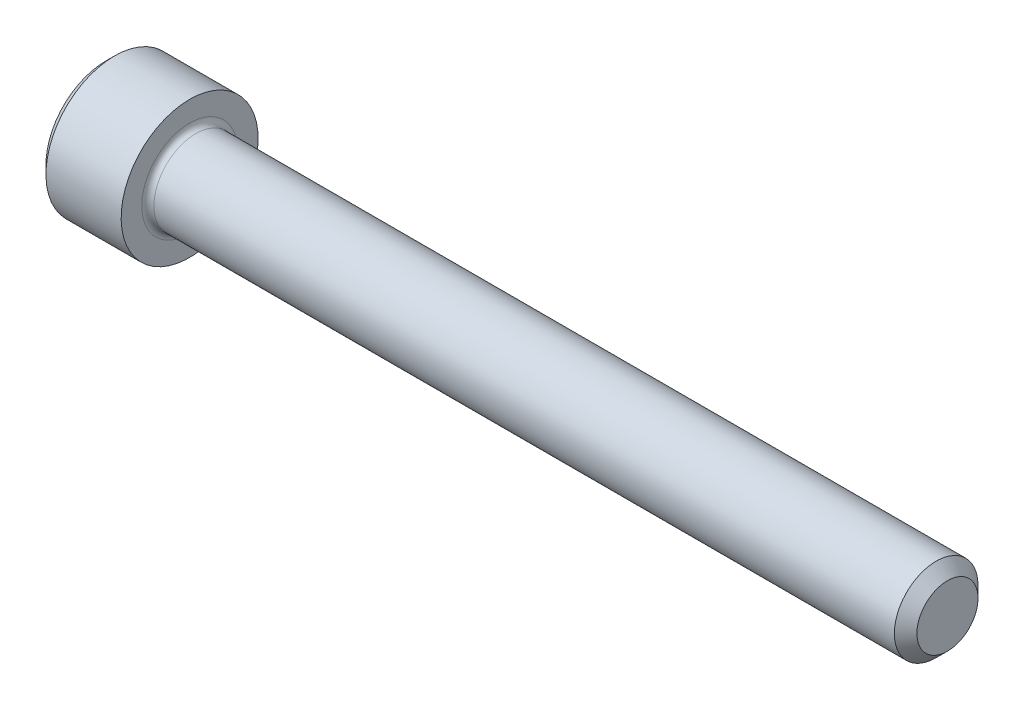
ISO-10303-21;
HEADER;
FILE_DESCRIPTION(('STEP AP214'),'2;1');
FILE_NAME('part.step','',(''),(''),'','','');
FILE_SCHEMA(('AUTOMOTIVE_DESIGN { 1 0 10303 214 1 1 1 1 }'));
ENDSEC;
DATA;
#1=APPLICATION_CONTEXT('core data for automotive mechanical design processes');
#2=APPLICATION_PROTOCOL_DEFINITION('international standard','automotive_design',2000,#1);
#3=PRODUCT_CONTEXT('',#1,'mechanical');
#4=PRODUCT('Part','Part','',(#3));
#5=PRODUCT_RELATED_PRODUCT_CATEGORY('part','',(#4));
#6=PRODUCT_DEFINITION_FORMATION('','',#4);
#7=PRODUCT_DEFINITION_CONTEXT('part definition',#1,'design');
#8=PRODUCT_DEFINITION('design','',#6,#7);
#9=PRODUCT_DEFINITION_SHAPE('','',#8);
#10=(LENGTH_UNIT() NAMED_UNIT(*) SI_UNIT(.MILLI.,.METRE.));
#11=(NAMED_UNIT(*) PLANE_ANGLE_UNIT() SI_UNIT($,.RADIAN.));
#12=(NAMED_UNIT(*) SI_UNIT($,.STERADIAN.) SOLID_ANGLE_UNIT());
#13=UNCERTAINTY_MEASURE_WITH_UNIT(LENGTH_MEASURE(1.E-05),#10,'distance_accuracy_value','');
#14=(GEOMETRIC_REPRESENTATION_CONTEXT(3) GLOBAL_UNCERTAINTY_ASSIGNED_CONTEXT((#13)) GLOBAL_UNIT_ASSIGNED_CONTEXT((#10,
#11,#12)) REPRESENTATION_CONTEXT('',''));
#15=CARTESIAN_POINT('',(0.,0.,0.));
#16=DIRECTION('',(0.,0.,1.));
#17=DIRECTION('',(1.,0.,0.));
#18=AXIS2_PLACEMENT_3D('',#15,#16,#17);
#19=CARTESIAN_POINT('',(-3.5052,0.,0.));
#20=DIRECTION('',(1.,0.,0.));
#21=DIRECTION('',(0.,1.,0.));
#22=AXIS2_PLACEMENT_3D('',#19,#20,#21);
#23=PLANE('',#22);
#24=CARTESIAN_POINT('',(-3.5052,0.,0.));
#25=DIRECTION('',(1.,0.,0.));
#26=DIRECTION('',(0.,1.,0.));
#27=AXIS2_PLACEMENT_3D('',#24,#25,#26);
#28=CIRCLE('',#27,2.5146);
#29=CARTESIAN_POINT('',(-3.5052,2.5146,0.));
#30=VERTEX_POINT('',#29);
#31=EDGE_CURVE('E11',#30,#30,#28,.F.);
#32=ORIENTED_EDGE('',*,*,#31,.T.);
#33=EDGE_LOOP('',(#32));
#34=FACE_BOUND('',#33,.T.);
#35=DIRECTION('',(0.,1.,0.));
#36=VECTOR('',#35,1.);
#37=CARTESIAN_POINT('',(-3.5052,-0.799225977639191,1.3843));
#38=LINE('',#37,#36);
#39=CARTESIAN_POINT('',(-3.5052,-0.799225977639191,1.3843));
#40=VERTEX_POINT('',#39);
#41=CARTESIAN_POINT('',(-3.5052,0.799225977639205,1.3843));
#42=VERTEX_POINT('',#41);
#43=EDGE_CURVE('E133',#40,#42,#38,.T.);
#44=ORIENTED_EDGE('',*,*,#43,.F.);
#45=DIRECTION('',(0.,-0.500000000000001,-0.866025403784438));
#46=VECTOR('',#45,1.);
#47=CARTESIAN_POINT('',(-3.5052,-0.799225977639191,1.3843));
#48=LINE('',#47,#46);
#49=CARTESIAN_POINT('',(-3.5052,-1.59845195527839,0.));
#50=VERTEX_POINT('',#49);
#51=EDGE_CURVE('E283',#40,#50,#48,.T.);
#52=ORIENTED_EDGE('',*,*,#51,.T.);
#53=DIRECTION('',(0.,0.499999999999999,-0.86602540378444));
#54=VECTOR('',#53,1.);
#55=CARTESIAN_POINT('',(-3.5052,-1.59845195527839,0.));
#56=LINE('',#55,#54);
#57=CARTESIAN_POINT('',(-3.5052,-0.799225977639196,-1.3843));
#58=VERTEX_POINT('',#57);
#59=EDGE_CURVE('E286',#50,#58,#56,.T.);
#60=ORIENTED_EDGE('',*,*,#59,.T.);
#61=DIRECTION('',(0.,-1.,0.));
#62=VECTOR('',#61,1.);
#63=CARTESIAN_POINT('',(-3.5052,0.799225977639202,-1.3843));
#64=LINE('',#63,#62);
#65=CARTESIAN_POINT('',(-3.5052,0.799225977639202,-1.3843));
#66=VERTEX_POINT('',#65);
#67=EDGE_CURVE('E289',#66,#58,#64,.T.);
#68=ORIENTED_EDGE('',*,*,#67,.F.);
#69=DIRECTION('',(0.,-0.500000000000001,-0.866025403784438));
#70=VECTOR('',#69,1.);
#71=CARTESIAN_POINT('',(-3.5052,1.5984519552784,0.));
#72=LINE('',#71,#70);
#73=CARTESIAN_POINT('',(-3.5052,1.5984519552784,0.));
#74=VERTEX_POINT('',#73);
#75=EDGE_CURVE('E129',#74,#66,#72,.T.);
#76=ORIENTED_EDGE('',*,*,#75,.F.);
#77=DIRECTION('',(0.,-0.499999999999999,0.866025403784439));
#78=VECTOR('',#77,1.);
#79=CARTESIAN_POINT('',(-3.5052,1.5984519552784,0.));
#80=LINE('',#79,#78);
#81=EDGE_CURVE('E50',#74,#42,#80,.T.);
#82=ORIENTED_EDGE('',*,*,#81,.T.);
#83=EDGE_LOOP('',(#44,#52,#60,#68,#76,#82));
#84=FACE_BOUND('',#83,.T.);
#85=ADVANCED_FACE('F35',(#34,#84),#23,.F.);
#86=CARTESIAN_POINT('',(31.75,0.,0.));
#87=DIRECTION('',(1.,0.,0.));
#88=DIRECTION('',(0.,1.,0.));
#89=AXIS2_PLACEMENT_3D('',#86,#87,#88);
#90=CYLINDRICAL_SURFACE('',#89,2.8702);
#91=CARTESIAN_POINT('',(-3.1496,0.,0.));
#92=DIRECTION('',(1.,0.,0.));
#93=DIRECTION('',(0.,1.,0.));
#94=AXIS2_PLACEMENT_3D('',#91,#92,#93);
#95=CIRCLE('',#94,2.8702);
#96=CARTESIAN_POINT('',(-3.1496,2.8702,0.));
#97=VERTEX_POINT('',#96);
#98=EDGE_CURVE('E43',#97,#97,#95,.T.);
#99=ORIENTED_EDGE('',*,*,#98,.T.);
#100=EDGE_LOOP('',(#99));
#101=FACE_BOUND('',#100,.T.);
#102=CARTESIAN_POINT('',(0.,0.,0.));
#103=DIRECTION('',(1.,0.,0.));
#104=DIRECTION('',(0.,1.,0.));
#105=AXIS2_PLACEMENT_3D('',#102,#103,#104);
#106=CIRCLE('',#105,2.8702);
#107=CARTESIAN_POINT('',(0.,2.8702,0.));
#108=VERTEX_POINT('',#107);
#109=EDGE_CURVE('E143',#108,#108,#106,.T.);
#110=ORIENTED_EDGE('',*,*,#109,.F.);
#111=EDGE_LOOP('',(#110));
#112=FACE_BOUND('',#111,.T.);
#113=ADVANCED_FACE('F161',(#101,#112),#90,.T.);
#114=CARTESIAN_POINT('',(0.,2.8702,0.));
#115=DIRECTION('',(-1.,0.,0.));
#116=DIRECTION('',(0.,-1.,0.));
#117=AXIS2_PLACEMENT_3D('',#114,#115,#116);
#118=PLANE('',#117);
#119=CARTESIAN_POINT('',(0.,0.,0.));
#120=DIRECTION('',(-1.,0.,0.));
#121=DIRECTION('',(0.,-1.,0.));
#122=AXIS2_PLACEMENT_3D('',#119,#120,#121);
#123=CIRCLE('',#122,2.00660000000001);
#124=CARTESIAN_POINT('',(0.,-2.00660000000001,0.));
#125=VERTEX_POINT('',#124);
#126=EDGE_CURVE('E150',#125,#125,#123,.T.);
#127=ORIENTED_EDGE('',*,*,#126,.T.);
#128=EDGE_LOOP('',(#127));
#129=FACE_BOUND('',#128,.T.);
#130=ORIENTED_EDGE('',*,*,#109,.T.);
#131=EDGE_LOOP('',(#130));
#132=FACE_BOUND('',#131,.T.);
#133=ADVANCED_FACE('F179',(#129,#132),#118,.F.);
#134=CARTESIAN_POINT('',(31.75,0.,0.));
#135=DIRECTION('',(1.,0.,0.));
#136=DIRECTION('',(0.,1.,0.));
#137=AXIS2_PLACEMENT_3D('',#134,#135,#136);
#138=CYLINDRICAL_SURFACE('',#137,1.75260000000001);
#139=CARTESIAN_POINT('',(31.27756,0.,0.));
#140=DIRECTION('',(-1.,0.,0.));
#141=DIRECTION('',(0.,-1.,0.));
#142=AXIS2_PLACEMENT_3D('',#139,#140,#141);
#143=CIRCLE('',#142,1.75260000000001);
#144=CARTESIAN_POINT('',(31.27756,-1.75260000000001,0.));
#145=VERTEX_POINT('',#144);
#146=EDGE_CURVE('E156',#145,#145,#143,.T.);
#147=ORIENTED_EDGE('',*,*,#146,.T.);
#148=EDGE_LOOP('',(#147));
#149=FACE_BOUND('',#148,.T.);
#150=CARTESIAN_POINT('',(0.253999999999997,0.,0.));
#151=DIRECTION('',(-1.,0.,0.));
#152=DIRECTION('',(0.,-1.,0.));
#153=AXIS2_PLACEMENT_3D('',#150,#151,#152);
#154=CIRCLE('',#153,1.75260000000001);
#155=CARTESIAN_POINT('',(0.253999999999997,-1.75260000000001,0.));
#156=VERTEX_POINT('',#155);
#157=EDGE_CURVE('E147',#156,#156,#154,.F.);
#158=ORIENTED_EDGE('',*,*,#157,.T.);
#159=EDGE_LOOP('',(#158));
#160=FACE_BOUND('',#159,.T.);
#161=ADVANCED_FACE('F197',(#149,#160),#138,.T.);
#162=CARTESIAN_POINT('',(31.75,1.7526,0.));
#163=DIRECTION('',(-1.,0.,0.));
#164=DIRECTION('',(0.,-1.,0.));
#165=AXIS2_PLACEMENT_3D('',#162,#163,#164);
#166=PLANE('',#165);
#167=CARTESIAN_POINT('',(31.75,0.,0.));
#168=DIRECTION('',(-1.,0.,0.));
#169=DIRECTION('',(0.,-1.,0.));
#170=AXIS2_PLACEMENT_3D('',#167,#168,#169);
#171=CIRCLE('',#170,1.28016);
#172=CARTESIAN_POINT('',(31.75,-1.28016,0.));
#173=VERTEX_POINT('',#172);
#174=EDGE_CURVE('E153',#173,#173,#171,.F.);
#175=ORIENTED_EDGE('',*,*,#174,.T.);
#176=EDGE_LOOP('',(#175));
#177=FACE_BOUND('',#176,.T.);
#178=ADVANCED_FACE('F199',(#177),#166,.F.);
#179=CARTESIAN_POINT('',(-1.8796,1.5984519552784,0.));
#180=DIRECTION('',(0.,-0.866025403784439,-0.499999999999999));
#181=DIRECTION('',(0.,0.499999999999999,-0.866025403784439));
#182=AXIS2_PLACEMENT_3D('',#179,#180,#181);
#183=PLANE('',#182);
#184=ORIENTED_EDGE('',*,*,#81,.F.);
#185=DIRECTION('',(-1.,0.,0.));
#186=VECTOR('',#185,1.);
#187=CARTESIAN_POINT('',(-1.8796,1.5984519552784,0.));
#188=LINE('',#187,#186);
#189=CARTESIAN_POINT('',(-1.8796,1.5984519552784,0.));
#190=VERTEX_POINT('',#189);
#191=EDGE_CURVE('E263',#190,#74,#188,.T.);
#192=ORIENTED_EDGE('',*,*,#191,.F.);
#193=DIRECTION('',(0.,-0.499999999999999,0.866025403784439));
#194=VECTOR('',#193,1.);
#195=CARTESIAN_POINT('',(-1.8796,1.5984519552784,0.));
#196=LINE('',#195,#194);
#197=CARTESIAN_POINT('',(-1.8796,1.1988389664588,0.692150000000001));
#198=VERTEX_POINT('',#197);
#199=EDGE_CURVE('E124',#190,#198,#196,.T.);
#200=ORIENTED_EDGE('',*,*,#199,.T.);
#201=CARTESIAN_POINT('',(-1.8796,0.799225977639205,1.3843));
#202=VERTEX_POINT('',#201);
#203=EDGE_CURVE('E115',#198,#202,#196,.T.);
#204=ORIENTED_EDGE('',*,*,#203,.T.);
#205=DIRECTION('',(-1.,0.,0.));
#206=VECTOR('',#205,1.);
#207=CARTESIAN_POINT('',(-1.8796,0.799225977639205,1.3843));
#208=LINE('',#207,#206);
#209=EDGE_CURVE('E127',#202,#42,#208,.T.);
#210=ORIENTED_EDGE('',*,*,#209,.T.);
#211=EDGE_LOOP('',(#184,#192,#200,#204,#210));
#212=FACE_BOUND('',#211,.T.);
#213=ADVANCED_FACE('F126',(#212),#183,.T.);
#214=CARTESIAN_POINT('',(-1.8796,-0.799225977639191,1.3843));
#215=DIRECTION('',(0.,0.,1.));
#216=DIRECTION('',(0.,-1.,0.));
#217=AXIS2_PLACEMENT_3D('',#214,#215,#216);
#218=PLANE('',#217);
#219=ORIENTED_EDGE('',*,*,#43,.T.);
#220=ORIENTED_EDGE('',*,*,#209,.F.);
#221=DIRECTION('',(0.,1.,0.));
#222=VECTOR('',#221,1.);
#223=CARTESIAN_POINT('',(-1.8796,-0.799225977639191,1.3843));
#224=LINE('',#223,#222);
#225=CARTESIAN_POINT('',(-1.8796,0.,1.3843));
#226=VERTEX_POINT('',#225);
#227=EDGE_CURVE('E112',#226,#202,#224,.T.);
#228=ORIENTED_EDGE('',*,*,#227,.F.);
#229=CARTESIAN_POINT('',(-1.8796,-0.799225977639191,1.3843));
#230=VERTEX_POINT('',#229);
#231=EDGE_CURVE('E123',#230,#226,#224,.T.);
#232=ORIENTED_EDGE('',*,*,#231,.F.);
#233=DIRECTION('',(-1.,0.,0.));
#234=VECTOR('',#233,1.);
#235=CARTESIAN_POINT('',(-1.8796,-0.799225977639191,1.3843));
#236=LINE('',#235,#234);
#237=EDGE_CURVE('E135',#230,#40,#236,.T.);
#238=ORIENTED_EDGE('',*,*,#237,.T.);
#239=EDGE_LOOP('',(#219,#220,#228,#232,#238));
#240=FACE_BOUND('',#239,.T.);
#241=ADVANCED_FACE('F131',(#240),#218,.F.);
#242=CARTESIAN_POINT('',(-1.8796,-0.799225977639191,1.3843));
#243=DIRECTION('',(0.,0.866025403784438,-0.500000000000001));
#244=DIRECTION('',(0.,0.500000000000001,0.866025403784438));
#245=AXIS2_PLACEMENT_3D('',#242,#243,#244);
#246=PLANE('',#245);
#247=ORIENTED_EDGE('',*,*,#51,.F.);
#248=ORIENTED_EDGE('',*,*,#237,.F.);
#249=DIRECTION('',(0.,-0.500000000000001,-0.866025403784438));
#250=VECTOR('',#249,1.);
#251=CARTESIAN_POINT('',(-1.8796,-0.799225977639191,1.3843));
#252=LINE('',#251,#250);
#253=CARTESIAN_POINT('',(-1.8796,-1.19883896645879,0.692149999999998));
#254=VERTEX_POINT('',#253);
#255=EDGE_CURVE('E299',#230,#254,#252,.T.);
#256=ORIENTED_EDGE('',*,*,#255,.T.);
#257=CARTESIAN_POINT('',(-1.8796,-1.59845195527839,0.));
#258=VERTEX_POINT('',#257);
#259=EDGE_CURVE('E297',#254,#258,#252,.T.);
#260=ORIENTED_EDGE('',*,*,#259,.T.);
#261=DIRECTION('',(-1.,0.,0.));
#262=VECTOR('',#261,1.);
#263=CARTESIAN_POINT('',(-1.8796,-1.59845195527839,0.));
#264=LINE('',#263,#262);
#265=EDGE_CURVE('E139',#258,#50,#264,.T.);
#266=ORIENTED_EDGE('',*,*,#265,.T.);
#267=EDGE_LOOP('',(#247,#248,#256,#260,#266));
#268=FACE_BOUND('',#267,.T.);
#269=ADVANCED_FACE('F214',(#268),#246,.T.);
#270=CARTESIAN_POINT('',(-1.8796,-1.59845195527839,0.));
#271=DIRECTION('',(0.,0.866025403784439,0.499999999999999));
#272=DIRECTION('',(0.,-0.499999999999999,0.866025403784439));
#273=AXIS2_PLACEMENT_3D('',#270,#271,#272);
#274=PLANE('',#273);
#275=ORIENTED_EDGE('',*,*,#59,.F.);
#276=ORIENTED_EDGE('',*,*,#265,.F.);
#277=DIRECTION('',(0.,0.499999999999999,-0.86602540378444));
#278=VECTOR('',#277,1.);
#279=CARTESIAN_POINT('',(-1.8796,-1.59845195527839,0.));
#280=LINE('',#279,#278);
#281=CARTESIAN_POINT('',(-1.8796,-1.1988389664588,-0.692149999999999));
#282=VERTEX_POINT('',#281);
#283=EDGE_CURVE('E58',#258,#282,#280,.T.);
#284=ORIENTED_EDGE('',*,*,#283,.T.);
#285=CARTESIAN_POINT('',(-1.8796,-0.799225977639196,-1.3843));
#286=VERTEX_POINT('',#285);
#287=EDGE_CURVE('E273',#282,#286,#280,.T.);
#288=ORIENTED_EDGE('',*,*,#287,.T.);
#289=DIRECTION('',(-1.,0.,0.));
#290=VECTOR('',#289,1.);
#291=CARTESIAN_POINT('',(-1.8796,-0.799225977639196,-1.3843));
#292=LINE('',#291,#290);
#293=EDGE_CURVE('E276',#286,#58,#292,.T.);
#294=ORIENTED_EDGE('',*,*,#293,.T.);
#295=EDGE_LOOP('',(#275,#276,#284,#288,#294));
#296=FACE_BOUND('',#295,.T.);
#297=ADVANCED_FACE('F217',(#296),#274,.T.);
#298=CARTESIAN_POINT('',(-1.8796,0.799225977639202,-1.3843));
#299=DIRECTION('',(0.,0.,-1.));
#300=DIRECTION('',(0.,1.,0.));
#301=AXIS2_PLACEMENT_3D('',#298,#299,#300);
#302=PLANE('',#301);
#303=ORIENTED_EDGE('',*,*,#67,.T.);
#304=ORIENTED_EDGE('',*,*,#293,.F.);
#305=DIRECTION('',(0.,-1.,0.));
#306=VECTOR('',#305,1.);
#307=CARTESIAN_POINT('',(-1.8796,0.799225977639202,-1.3843));
#308=LINE('',#307,#306);
#309=CARTESIAN_POINT('',(-1.8796,0.,-1.3843));
#310=VERTEX_POINT('',#309);
#311=EDGE_CURVE('E272',#310,#286,#308,.T.);
#312=ORIENTED_EDGE('',*,*,#311,.F.);
#313=CARTESIAN_POINT('',(-1.8796,0.799225977639202,-1.3843));
#314=VERTEX_POINT('',#313);
#315=EDGE_CURVE('E251',#314,#310,#308,.T.);
#316=ORIENTED_EDGE('',*,*,#315,.F.);
#317=DIRECTION('',(-1.,0.,0.));
#318=VECTOR('',#317,1.);
#319=CARTESIAN_POINT('',(-1.8796,0.799225977639202,-1.3843));
#320=LINE('',#319,#318);
#321=EDGE_CURVE('E261',#314,#66,#320,.T.);
#322=ORIENTED_EDGE('',*,*,#321,.T.);
#323=EDGE_LOOP('',(#303,#304,#312,#316,#322));
#324=FACE_BOUND('',#323,.T.);
#325=ADVANCED_FACE('F221',(#324),#302,.F.);
#326=CARTESIAN_POINT('',(-1.8796,1.5984519552784,0.));
#327=DIRECTION('',(0.,0.866025403784438,-0.500000000000001));
#328=DIRECTION('',(0.,0.500000000000001,0.866025403784438));
#329=AXIS2_PLACEMENT_3D('',#326,#327,#328);
#330=PLANE('',#329);
#331=ORIENTED_EDGE('',*,*,#75,.T.);
#332=ORIENTED_EDGE('',*,*,#321,.F.);
#333=DIRECTION('',(0.,-0.500000000000001,-0.866025403784438));
#334=VECTOR('',#333,1.);
#335=CARTESIAN_POINT('',(-1.8796,1.5984519552784,0.));
#336=LINE('',#335,#334);
#337=CARTESIAN_POINT('',(-1.8796,1.1988389664588,-0.692150000000005));
#338=VERTEX_POINT('',#337);
#339=EDGE_CURVE('E248',#338,#314,#336,.T.);
#340=ORIENTED_EDGE('',*,*,#339,.F.);
#341=EDGE_CURVE('E259',#190,#338,#336,.T.);
#342=ORIENTED_EDGE('',*,*,#341,.F.);
#343=ORIENTED_EDGE('',*,*,#191,.T.);
#344=EDGE_LOOP('',(#331,#332,#340,#342,#343));
#345=FACE_BOUND('',#344,.T.);
#346=ADVANCED_FACE('F224',(#345),#330,.F.);
#347=CARTESIAN_POINT('',(-1.8796,0.,2.7686));
#348=DIRECTION('',(1.,0.,0.));
#349=DIRECTION('',(0.,0.,-1.));
#350=AXIS2_PLACEMENT_3D('',#347,#348,#349);
#351=PLANE('',#350);
#352=CARTESIAN_POINT('',(-1.8796,0.,0.));
#353=DIRECTION('',(1.,0.,0.));
#354=DIRECTION('',(0.,1.,0.));
#355=AXIS2_PLACEMENT_3D('',#352,#353,#354);
#356=CIRCLE('',#355,1.3843);
#357=EDGE_CURVE('E137',#310,#338,#356,.T.);
#358=ORIENTED_EDGE('',*,*,#357,.T.);
#359=ORIENTED_EDGE('',*,*,#339,.T.);
#360=ORIENTED_EDGE('',*,*,#315,.T.);
#361=EDGE_LOOP('',(#358,#359,#360));
#362=FACE_BOUND('',#361,.T.);
#363=ADVANCED_FACE('F228',(#362),#351,.F.);
#364=EDGE_CURVE('E134',#338,#198,#356,.T.);
#365=ORIENTED_EDGE('',*,*,#364,.T.);
#366=ORIENTED_EDGE('',*,*,#199,.F.);
#367=ORIENTED_EDGE('',*,*,#341,.T.);
#368=EDGE_LOOP('',(#365,#366,#367));
#369=FACE_BOUND('',#368,.T.);
#370=ADVANCED_FACE('F239',(#369),#351,.F.);
#371=EDGE_CURVE('E118',#198,#226,#356,.T.);
#372=ORIENTED_EDGE('',*,*,#371,.T.);
#373=ORIENTED_EDGE('',*,*,#227,.T.);
#374=ORIENTED_EDGE('',*,*,#203,.F.);
#375=EDGE_LOOP('',(#372,#373,#374));
#376=FACE_BOUND('',#375,.T.);
#377=ADVANCED_FACE('F114',(#376),#351,.F.);
#378=EDGE_CURVE('E144',#226,#254,#356,.T.);
#379=ORIENTED_EDGE('',*,*,#378,.T.);
#380=ORIENTED_EDGE('',*,*,#255,.F.);
#381=ORIENTED_EDGE('',*,*,#231,.T.);
#382=EDGE_LOOP('',(#379,#380,#381));
#383=FACE_BOUND('',#382,.T.);
#384=ADVANCED_FACE('F236',(#383),#351,.F.);
#385=EDGE_CURVE('E267',#254,#282,#356,.T.);
#386=ORIENTED_EDGE('',*,*,#385,.T.);
#387=ORIENTED_EDGE('',*,*,#283,.F.);
#388=ORIENTED_EDGE('',*,*,#259,.F.);
#389=EDGE_LOOP('',(#386,#387,#388));
#390=FACE_BOUND('',#389,.T.);
#391=ADVANCED_FACE('F231',(#390),#351,.F.);
#392=EDGE_CURVE('E255',#282,#310,#356,.T.);
#393=ORIENTED_EDGE('',*,*,#392,.T.);
#394=ORIENTED_EDGE('',*,*,#311,.T.);
#395=ORIENTED_EDGE('',*,*,#287,.F.);
#396=EDGE_LOOP('',(#393,#394,#395));
#397=FACE_BOUND('',#396,.T.);
#398=ADVANCED_FACE('F190',(#397),#351,.F.);
#399=CARTESIAN_POINT('',(-1.8796,0.,0.));
#400=DIRECTION('',(-1.,0.,0.));
#401=DIRECTION('',(0.,-1.,0.));
#402=AXIS2_PLACEMENT_3D('',#399,#400,#401);
#403=CONICAL_SURFACE('',#402,1.3843,1.04719755119659);
#404=CARTESIAN_POINT('',(-1.08037402236079,0.,0.));
#405=VERTEX_POINT('',#404);
#406=VERTEX_LOOP('',#405);
#407=FACE_BOUND('',#406,.T.);
#408=ORIENTED_EDGE('',*,*,#371,.F.);
#409=ORIENTED_EDGE('',*,*,#364,.F.);
#410=ORIENTED_EDGE('',*,*,#357,.F.);
#411=ORIENTED_EDGE('',*,*,#392,.F.);
#412=ORIENTED_EDGE('',*,*,#385,.F.);
#413=ORIENTED_EDGE('',*,*,#378,.F.);
#414=EDGE_LOOP('',(#408,#409,#410,#411,#412,#413));
#415=FACE_BOUND('',#414,.T.);
#416=ADVANCED_FACE('F185',(#407,#415),#403,.F.);
#417=CARTESIAN_POINT('',(0.253999999999997,0.,0.));
#418=DIRECTION('',(-1.,0.,0.));
#419=DIRECTION('',(0.,-1.,0.));
#420=AXIS2_PLACEMENT_3D('',#417,#418,#419);
#421=TOROIDAL_SURFACE('',#420,2.00660000000001,0.254);
#422=ORIENTED_EDGE('',*,*,#126,.F.);
#423=EDGE_LOOP('',(#422));
#424=FACE_BOUND('',#423,.T.);
#425=ORIENTED_EDGE('',*,*,#157,.F.);
#426=EDGE_LOOP('',(#425));
#427=FACE_BOUND('',#426,.T.);
#428=ADVANCED_FACE('F170',(#424,#427),#421,.F.);
#429=CARTESIAN_POINT('',(31.75,0.,0.));
#430=DIRECTION('',(-1.,0.,0.));
#431=DIRECTION('',(0.,-1.,0.));
#432=AXIS2_PLACEMENT_3D('',#429,#430,#431);
#433=CONICAL_SURFACE('',#432,1.28016,0.785398163397446);
#434=ORIENTED_EDGE('',*,*,#146,.F.);
#435=EDGE_LOOP('',(#434));
#436=FACE_BOUND('',#435,.T.);
#437=ORIENTED_EDGE('',*,*,#174,.F.);
#438=EDGE_LOOP('',(#437));
#439=FACE_BOUND('',#438,.T.);
#440=ADVANCED_FACE('F165',(#436,#439),#433,.T.);
#441=CARTESIAN_POINT('',(-3.1496,0.,0.));
#442=DIRECTION('',(1.,0.,0.));
#443=DIRECTION('',(0.,1.,0.));
#444=AXIS2_PLACEMENT_3D('',#441,#442,#443);
#445=CONICAL_SURFACE('',#444,2.8702,0.785398163397451);
#446=ORIENTED_EDGE('',*,*,#31,.F.);
#447=EDGE_LOOP('',(#446));
#448=FACE_BOUND('',#447,.T.);
#449=ORIENTED_EDGE('',*,*,#98,.F.);
#450=EDGE_LOOP('',(#449));
#451=FACE_BOUND('',#450,.T.);
#452=ADVANCED_FACE('F37',(#448,#451),#445,.T.);
#453=CLOSED_SHELL('',(#85,#113,#133,#161,#178,#213,#241,#269,#297,#325,#346,#363,#370,#377,#384,
#391,#398,#416,#428,#440,#452));
#454=MANIFOLD_SOLID_BREP('B2',#453);
#455=ADVANCED_BREP_SHAPE_REPRESENTATION('',(#18,#454),#14);
#456=SHAPE_DEFINITION_REPRESENTATION(#9,#455);
ENDSEC;
END-ISO-10303-21;
